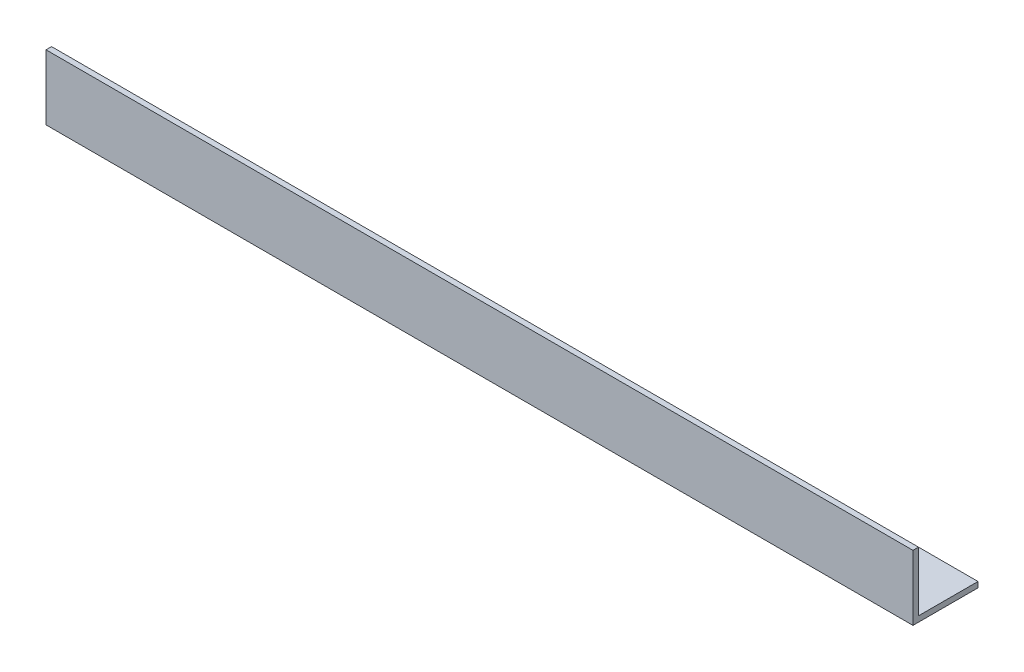
ISO-10303-21;
HEADER;
FILE_DESCRIPTION(('STEP AP214'),'2;1');
FILE_NAME('part.step','',(''),(''),'','','');
FILE_SCHEMA(('AUTOMOTIVE_DESIGN { 1 0 10303 214 1 1 1 1 }'));
ENDSEC;
DATA;
#1=APPLICATION_CONTEXT('core data for automotive mechanical design processes');
#2=APPLICATION_PROTOCOL_DEFINITION('international standard','automotive_design',2000,#1);
#3=PRODUCT_CONTEXT('',#1,'mechanical');
#4=PRODUCT('Part','Part','',(#3));
#5=PRODUCT_RELATED_PRODUCT_CATEGORY('part','',(#4));
#6=PRODUCT_DEFINITION_FORMATION('','',#4);
#7=PRODUCT_DEFINITION_CONTEXT('part definition',#1,'design');
#8=PRODUCT_DEFINITION('design','',#6,#7);
#9=PRODUCT_DEFINITION_SHAPE('','',#8);
#10=(LENGTH_UNIT() NAMED_UNIT(*) SI_UNIT(.MILLI.,.METRE.));
#11=(NAMED_UNIT(*) PLANE_ANGLE_UNIT() SI_UNIT($,.RADIAN.));
#12=(NAMED_UNIT(*) SI_UNIT($,.STERADIAN.) SOLID_ANGLE_UNIT());
#13=UNCERTAINTY_MEASURE_WITH_UNIT(LENGTH_MEASURE(1.E-05),#10,'distance_accuracy_value','');
#14=(GEOMETRIC_REPRESENTATION_CONTEXT(3) GLOBAL_UNCERTAINTY_ASSIGNED_CONTEXT((#13)) GLOBAL_UNIT_ASSIGNED_CONTEXT((#10,
#11,#12)) REPRESENTATION_CONTEXT('',''));
#15=CARTESIAN_POINT('',(0.,0.,0.));
#16=DIRECTION('',(0.,0.,1.));
#17=DIRECTION('',(1.,0.,0.));
#18=AXIS2_PLACEMENT_3D('',#15,#16,#17);
#19=CARTESIAN_POINT('',(254.,-7.8994,7.8994));
#20=DIRECTION('',(0.,0.,1.));
#21=DIRECTION('',(1.,0.,0.));
#22=AXIS2_PLACEMENT_3D('',#19,#20,#21);
#23=PLANE('',#22);
#24=DIRECTION('',(0.,1.,0.));
#25=VECTOR('',#24,1.);
#26=CARTESIAN_POINT('',(0.,-7.8994,7.8994));
#27=LINE('',#26,#25);
#28=CARTESIAN_POINT('',(0.,-7.8994,7.8994));
#29=VERTEX_POINT('',#28);
#30=CARTESIAN_POINT('',(0.,9.525,7.8994));
#31=VERTEX_POINT('',#30);
#32=EDGE_CURVE('E131',#29,#31,#27,.T.);
#33=ORIENTED_EDGE('',*,*,#32,.T.);
#34=DIRECTION('',(-1.,0.,0.));
#35=VECTOR('',#34,1.);
#36=CARTESIAN_POINT('',(254.,9.525,7.8994));
#37=LINE('',#36,#35);
#38=CARTESIAN_POINT('',(254.,9.525,7.8994));
#39=VERTEX_POINT('',#38);
#40=EDGE_CURVE('E11',#39,#31,#37,.T.);
#41=ORIENTED_EDGE('',*,*,#40,.F.);
#42=DIRECTION('',(0.,1.,0.));
#43=VECTOR('',#42,1.);
#44=CARTESIAN_POINT('',(254.,-7.8994,7.8994));
#45=LINE('',#44,#43);
#46=CARTESIAN_POINT('',(254.,-7.8994,7.8994));
#47=VERTEX_POINT('',#46);
#48=EDGE_CURVE('E141',#47,#39,#45,.T.);
#49=ORIENTED_EDGE('',*,*,#48,.F.);
#50=DIRECTION('',(-1.,0.,0.));
#51=VECTOR('',#50,1.);
#52=CARTESIAN_POINT('',(254.,-7.8994,7.8994));
#53=LINE('',#52,#51);
#54=EDGE_CURVE('E127',#47,#29,#53,.T.);
#55=ORIENTED_EDGE('',*,*,#54,.T.);
#56=EDGE_LOOP('',(#33,#41,#49,#55));
#57=FACE_BOUND('',#56,.T.);
#58=ADVANCED_FACE('F36',(#57),#23,.F.);
#59=CARTESIAN_POINT('',(254.,9.525,9.525));
#60=DIRECTION('',(0.,-1.,0.));
#61=DIRECTION('',(0.,0.,-1.));
#62=AXIS2_PLACEMENT_3D('',#59,#60,#61);
#63=PLANE('',#62);
#64=DIRECTION('',(0.,0.,1.));
#65=VECTOR('',#64,1.);
#66=CARTESIAN_POINT('',(0.,9.525,9.525));
#67=LINE('',#66,#65);
#68=CARTESIAN_POINT('',(0.,9.525,9.525));
#69=VERTEX_POINT('',#68);
#70=EDGE_CURVE('E134',#31,#69,#67,.T.);
#71=ORIENTED_EDGE('',*,*,#70,.T.);
#72=DIRECTION('',(-1.,0.,0.));
#73=VECTOR('',#72,1.);
#74=CARTESIAN_POINT('',(254.,9.525,9.525));
#75=LINE('',#74,#73);
#76=CARTESIAN_POINT('',(254.,9.525,9.525));
#77=VERTEX_POINT('',#76);
#78=EDGE_CURVE('E45',#77,#69,#75,.T.);
#79=ORIENTED_EDGE('',*,*,#78,.F.);
#80=DIRECTION('',(0.,0.,1.));
#81=VECTOR('',#80,1.);
#82=CARTESIAN_POINT('',(254.,9.525,9.525));
#83=LINE('',#82,#81);
#84=EDGE_CURVE('E95',#39,#77,#83,.T.);
#85=ORIENTED_EDGE('',*,*,#84,.F.);
#86=ORIENTED_EDGE('',*,*,#40,.T.);
#87=EDGE_LOOP('',(#71,#79,#85,#86));
#88=FACE_BOUND('',#87,.T.);
#89=ADVANCED_FACE('F169',(#88),#63,.F.);
#90=CARTESIAN_POINT('',(254.,-9.525,9.525));
#91=DIRECTION('',(0.,0.,-1.));
#92=DIRECTION('',(0.,1.,0.));
#93=AXIS2_PLACEMENT_3D('',#90,#91,#92);
#94=PLANE('',#93);
#95=DIRECTION('',(0.,-1.,0.));
#96=VECTOR('',#95,1.);
#97=CARTESIAN_POINT('',(0.,-9.525,9.525));
#98=LINE('',#97,#96);
#99=CARTESIAN_POINT('',(0.,-9.525,9.525));
#100=VERTEX_POINT('',#99);
#101=EDGE_CURVE('E136',#69,#100,#98,.T.);
#102=ORIENTED_EDGE('',*,*,#101,.T.);
#103=DIRECTION('',(-1.,0.,0.));
#104=VECTOR('',#103,1.);
#105=CARTESIAN_POINT('',(254.,-9.525,9.525));
#106=LINE('',#105,#104);
#107=CARTESIAN_POINT('',(254.,-9.525,9.525));
#108=VERTEX_POINT('',#107);
#109=EDGE_CURVE('E119',#108,#100,#106,.T.);
#110=ORIENTED_EDGE('',*,*,#109,.F.);
#111=DIRECTION('',(0.,-1.,0.));
#112=VECTOR('',#111,1.);
#113=CARTESIAN_POINT('',(254.,-9.525,9.525));
#114=LINE('',#113,#112);
#115=EDGE_CURVE('E108',#77,#108,#114,.T.);
#116=ORIENTED_EDGE('',*,*,#115,.F.);
#117=ORIENTED_EDGE('',*,*,#78,.T.);
#118=EDGE_LOOP('',(#102,#110,#116,#117));
#119=FACE_BOUND('',#118,.T.);
#120=ADVANCED_FACE('F151',(#119),#94,.F.);
#121=CARTESIAN_POINT('',(254.,-9.525,9.525));
#122=DIRECTION('',(0.,1.,0.));
#123=DIRECTION('',(0.,0.,1.));
#124=AXIS2_PLACEMENT_3D('',#121,#122,#123);
#125=PLANE('',#124);
#126=DIRECTION('',(0.,0.,-1.));
#127=VECTOR('',#126,1.);
#128=CARTESIAN_POINT('',(0.,-9.525,9.525));
#129=LINE('',#128,#127);
#130=CARTESIAN_POINT('',(0.,-9.525,-9.525));
#131=VERTEX_POINT('',#130);
#132=EDGE_CURVE('E117',#100,#131,#129,.T.);
#133=ORIENTED_EDGE('',*,*,#132,.T.);
#134=DIRECTION('',(-1.,0.,0.));
#135=VECTOR('',#134,1.);
#136=CARTESIAN_POINT('',(254.,-9.525,-9.525));
#137=LINE('',#136,#135);
#138=CARTESIAN_POINT('',(254.,-9.525,-9.525));
#139=VERTEX_POINT('',#138);
#140=EDGE_CURVE('E114',#139,#131,#137,.T.);
#141=ORIENTED_EDGE('',*,*,#140,.F.);
#142=DIRECTION('',(0.,0.,-1.));
#143=VECTOR('',#142,1.);
#144=CARTESIAN_POINT('',(254.,-9.525,9.525));
#145=LINE('',#144,#143);
#146=EDGE_CURVE('E102',#108,#139,#145,.T.);
#147=ORIENTED_EDGE('',*,*,#146,.F.);
#148=ORIENTED_EDGE('',*,*,#109,.T.);
#149=EDGE_LOOP('',(#133,#141,#147,#148));
#150=FACE_BOUND('',#149,.T.);
#151=ADVANCED_FACE('F115',(#150),#125,.F.);
#152=CARTESIAN_POINT('',(254.,-9.525,-9.525));
#153=DIRECTION('',(0.,0.,1.));
#154=DIRECTION('',(1.,0.,0.));
#155=AXIS2_PLACEMENT_3D('',#152,#153,#154);
#156=PLANE('',#155);
#157=DIRECTION('',(0.,1.,0.));
#158=VECTOR('',#157,1.);
#159=CARTESIAN_POINT('',(0.,-9.525,-9.525));
#160=LINE('',#159,#158);
#161=CARTESIAN_POINT('',(0.,-7.8994,-9.525));
#162=VERTEX_POINT('',#161);
#163=EDGE_CURVE('E80',#131,#162,#160,.T.);
#164=ORIENTED_EDGE('',*,*,#163,.T.);
#165=DIRECTION('',(-1.,0.,0.));
#166=VECTOR('',#165,1.);
#167=CARTESIAN_POINT('',(254.,-7.8994,-9.525));
#168=LINE('',#167,#166);
#169=CARTESIAN_POINT('',(254.,-7.8994,-9.525));
#170=VERTEX_POINT('',#169);
#171=EDGE_CURVE('E120',#170,#162,#168,.T.);
#172=ORIENTED_EDGE('',*,*,#171,.F.);
#173=DIRECTION('',(0.,1.,0.));
#174=VECTOR('',#173,1.);
#175=CARTESIAN_POINT('',(254.,-9.525,-9.525));
#176=LINE('',#175,#174);
#177=EDGE_CURVE('E106',#139,#170,#176,.T.);
#178=ORIENTED_EDGE('',*,*,#177,.F.);
#179=ORIENTED_EDGE('',*,*,#140,.T.);
#180=EDGE_LOOP('',(#164,#172,#178,#179));
#181=FACE_BOUND('',#180,.T.);
#182=ADVANCED_FACE('F122',(#181),#156,.F.);
#183=CARTESIAN_POINT('',(254.,-7.8994,7.8994));
#184=DIRECTION('',(0.,-1.,0.));
#185=DIRECTION('',(0.,0.,-1.));
#186=AXIS2_PLACEMENT_3D('',#183,#184,#185);
#187=PLANE('',#186);
#188=DIRECTION('',(0.,0.,1.));
#189=VECTOR('',#188,1.);
#190=CARTESIAN_POINT('',(0.,-7.8994,7.8994));
#191=LINE('',#190,#189);
#192=EDGE_CURVE('E86',#162,#29,#191,.T.);
#193=ORIENTED_EDGE('',*,*,#192,.T.);
#194=ORIENTED_EDGE('',*,*,#54,.F.);
#195=DIRECTION('',(0.,0.,1.));
#196=VECTOR('',#195,1.);
#197=CARTESIAN_POINT('',(254.,-7.8994,7.8994));
#198=LINE('',#197,#196);
#199=EDGE_CURVE('E56',#170,#47,#198,.T.);
#200=ORIENTED_EDGE('',*,*,#199,.F.);
#201=ORIENTED_EDGE('',*,*,#171,.T.);
#202=EDGE_LOOP('',(#193,#194,#200,#201));
#203=FACE_BOUND('',#202,.T.);
#204=ADVANCED_FACE('F158',(#203),#187,.F.);
#205=CARTESIAN_POINT('',(254.,0.,0.));
#206=DIRECTION('',(-1.,0.,0.));
#207=DIRECTION('',(0.,0.,1.));
#208=AXIS2_PLACEMENT_3D('',#205,#206,#207);
#209=PLANE('',#208);
#210=ORIENTED_EDGE('',*,*,#48,.T.);
#211=ORIENTED_EDGE('',*,*,#84,.T.);
#212=ORIENTED_EDGE('',*,*,#115,.T.);
#213=ORIENTED_EDGE('',*,*,#146,.T.);
#214=ORIENTED_EDGE('',*,*,#177,.T.);
#215=ORIENTED_EDGE('',*,*,#199,.T.);
#216=EDGE_LOOP('',(#210,#211,#212,#213,#214,#215));
#217=FACE_BOUND('',#216,.T.);
#218=ADVANCED_FACE('F104',(#217),#209,.F.);
#219=CARTESIAN_POINT('',(0.,0.,0.));
#220=DIRECTION('',(-1.,0.,0.));
#221=DIRECTION('',(0.,0.,1.));
#222=AXIS2_PLACEMENT_3D('',#219,#220,#221);
#223=PLANE('',#222);
#224=ORIENTED_EDGE('',*,*,#32,.F.);
#225=ORIENTED_EDGE('',*,*,#192,.F.);
#226=ORIENTED_EDGE('',*,*,#163,.F.);
#227=ORIENTED_EDGE('',*,*,#132,.F.);
#228=ORIENTED_EDGE('',*,*,#101,.F.);
#229=ORIENTED_EDGE('',*,*,#70,.F.);
#230=EDGE_LOOP('',(#224,#225,#226,#227,#228,#229));
#231=FACE_BOUND('',#230,.T.);
#232=ADVANCED_FACE('F154',(#231),#223,.T.);
#233=CLOSED_SHELL('',(#58,#89,#120,#151,#182,#204,#218,#232));
#234=MANIFOLD_SOLID_BREP('B2',#233);
#235=ADVANCED_BREP_SHAPE_REPRESENTATION('',(#18,#234),#14);
#236=SHAPE_DEFINITION_REPRESENTATION(#9,#235);
ENDSEC;
END-ISO-10303-21;
